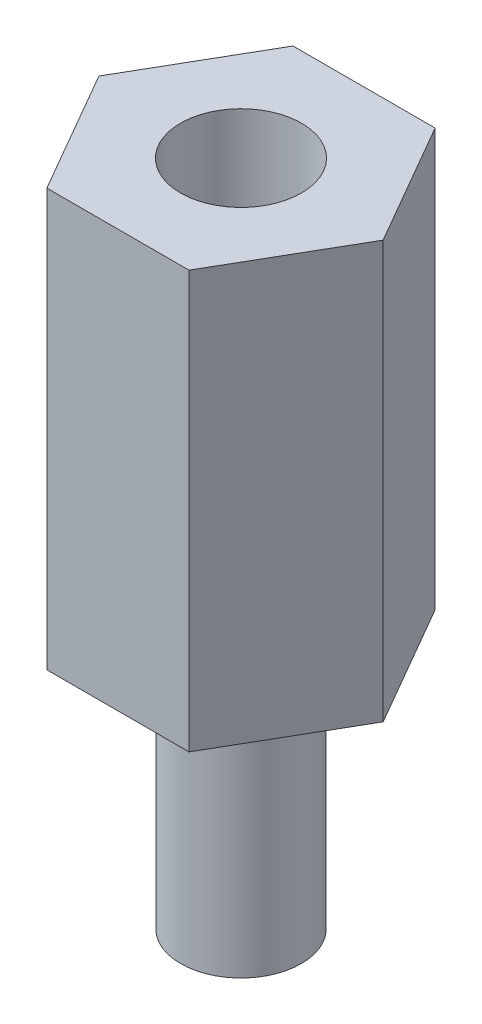
ISO-10303-21;
HEADER;
FILE_DESCRIPTION(('STEP AP214'),'2;1');
FILE_NAME('part.step','',(''),(''),'','','');
FILE_SCHEMA(('AUTOMOTIVE_DESIGN { 1 0 10303 214 1 1 1 1 }'));
ENDSEC;
DATA;
#1=APPLICATION_CONTEXT('core data for automotive mechanical design processes');
#2=APPLICATION_PROTOCOL_DEFINITION('international standard','automotive_design',2000,#1);
#3=PRODUCT_CONTEXT('',#1,'mechanical');
#4=PRODUCT('Part','Part','',(#3));
#5=PRODUCT_RELATED_PRODUCT_CATEGORY('part','',(#4));
#6=PRODUCT_DEFINITION_FORMATION('','',#4);
#7=PRODUCT_DEFINITION_CONTEXT('part definition',#1,'design');
#8=PRODUCT_DEFINITION('design','',#6,#7);
#9=PRODUCT_DEFINITION_SHAPE('','',#8);
#10=(LENGTH_UNIT() NAMED_UNIT(*) SI_UNIT(.MILLI.,.METRE.));
#11=(NAMED_UNIT(*) PLANE_ANGLE_UNIT() SI_UNIT($,.RADIAN.));
#12=(NAMED_UNIT(*) SI_UNIT($,.STERADIAN.) SOLID_ANGLE_UNIT());
#13=UNCERTAINTY_MEASURE_WITH_UNIT(LENGTH_MEASURE(1.E-05),#10,'distance_accuracy_value','');
#14=(GEOMETRIC_REPRESENTATION_CONTEXT(3) GLOBAL_UNCERTAINTY_ASSIGNED_CONTEXT((#13)) GLOBAL_UNIT_ASSIGNED_CONTEXT((#10,
#11,#12)) REPRESENTATION_CONTEXT('',''));
#15=CARTESIAN_POINT('',(0.,0.,0.));
#16=DIRECTION('',(0.,0.,1.));
#17=DIRECTION('',(1.,0.,0.));
#18=AXIS2_PLACEMENT_3D('',#15,#16,#17);
#19=CARTESIAN_POINT('',(1.70318329410942,10.,2.94999999999997));
#20=DIRECTION('',(-0.866025403784442,0.,-0.499999999999995));
#21=DIRECTION('',(-0.499999999999995,0.,0.866025403784442));
#22=AXIS2_PLACEMENT_3D('',#19,#20,#21);
#23=PLANE('',#22);
#24=DIRECTION('',(0.499999999999995,0.,-0.866025403784442));
#25=VECTOR('',#24,1.);
#26=CARTESIAN_POINT('',(1.70318329410942,0.,2.94999999999997));
#27=LINE('',#26,#25);
#28=CARTESIAN_POINT('',(1.70318329410942,0.,2.94999999999997));
#29=VERTEX_POINT('',#28);
#30=CARTESIAN_POINT('',(3.40636658821878,0.,0.));
#31=VERTEX_POINT('',#30);
#32=EDGE_CURVE('E118',#29,#31,#27,.T.);
#33=ORIENTED_EDGE('',*,*,#32,.T.);
#34=DIRECTION('',(0.,-1.,0.));
#35=VECTOR('',#34,1.);
#36=CARTESIAN_POINT('',(3.40636658821878,10.,0.));
#37=LINE('',#36,#35);
#38=CARTESIAN_POINT('',(3.40636658821878,10.,0.));
#39=VERTEX_POINT('',#38);
#40=EDGE_CURVE('E41',#39,#31,#37,.T.);
#41=ORIENTED_EDGE('',*,*,#40,.F.);
#42=DIRECTION('',(0.499999999999995,0.,-0.866025403784442));
#43=VECTOR('',#42,1.);
#44=CARTESIAN_POINT('',(1.70318329410942,10.,2.94999999999997));
#45=LINE('',#44,#43);
#46=CARTESIAN_POINT('',(1.70318329410942,10.,2.94999999999997));
#47=VERTEX_POINT('',#46);
#48=EDGE_CURVE('E129',#47,#39,#45,.T.);
#49=ORIENTED_EDGE('',*,*,#48,.F.);
#50=DIRECTION('',(0.,-1.,0.));
#51=VECTOR('',#50,1.);
#52=CARTESIAN_POINT('',(1.70318329410942,10.,2.94999999999997));
#53=LINE('',#52,#51);
#54=EDGE_CURVE('E114',#47,#29,#53,.T.);
#55=ORIENTED_EDGE('',*,*,#54,.T.);
#56=EDGE_LOOP('',(#33,#41,#49,#55));
#57=FACE_BOUND('',#56,.T.);
#58=ADVANCED_FACE('F33',(#57),#23,.F.);
#59=CARTESIAN_POINT('',(3.40636658821878,10.,0.));
#60=DIRECTION('',(-0.866025403784438,0.,0.500000000000001));
#61=DIRECTION('',(0.500000000000001,0.,0.866025403784438));
#62=AXIS2_PLACEMENT_3D('',#59,#60,#61);
#63=PLANE('',#62);
#64=DIRECTION('',(-0.500000000000001,0.,-0.866025403784438));
#65=VECTOR('',#64,1.);
#66=CARTESIAN_POINT('',(3.40636658821878,0.,0.));
#67=LINE('',#66,#65);
#68=CARTESIAN_POINT('',(1.70318329410938,0.,-2.94999999999999));
#69=VERTEX_POINT('',#68);
#70=EDGE_CURVE('E121',#31,#69,#67,.T.);
#71=ORIENTED_EDGE('',*,*,#70,.T.);
#72=DIRECTION('',(0.,-1.,0.));
#73=VECTOR('',#72,1.);
#74=CARTESIAN_POINT('',(1.70318329410938,10.,-2.94999999999999));
#75=LINE('',#74,#73);
#76=CARTESIAN_POINT('',(1.70318329410938,10.,-2.94999999999999));
#77=VERTEX_POINT('',#76);
#78=EDGE_CURVE('E133',#77,#69,#75,.T.);
#79=ORIENTED_EDGE('',*,*,#78,.F.);
#80=DIRECTION('',(-0.500000000000001,0.,-0.866025403784438));
#81=VECTOR('',#80,1.);
#82=CARTESIAN_POINT('',(3.40636658821878,10.,0.));
#83=LINE('',#82,#81);
#84=EDGE_CURVE('E87',#39,#77,#83,.T.);
#85=ORIENTED_EDGE('',*,*,#84,.F.);
#86=ORIENTED_EDGE('',*,*,#40,.T.);
#87=EDGE_LOOP('',(#71,#79,#85,#86));
#88=FACE_BOUND('',#87,.T.);
#89=ADVANCED_FACE('F136',(#88),#63,.F.);
#90=CARTESIAN_POINT('',(1.70318329410938,10.,-2.94999999999999));
#91=DIRECTION('',(0.,0.,1.));
#92=DIRECTION('',(1.,0.,0.));
#93=AXIS2_PLACEMENT_3D('',#90,#91,#92);
#94=PLANE('',#93);
#95=DIRECTION('',(-1.,0.,0.));
#96=VECTOR('',#95,1.);
#97=CARTESIAN_POINT('',(1.70318329410938,0.,-2.94999999999999));
#98=LINE('',#97,#96);
#99=CARTESIAN_POINT('',(-1.7031832941094,0.,-2.94999999999998));
#100=VERTEX_POINT('',#99);
#101=EDGE_CURVE('E124',#69,#100,#98,.T.);
#102=ORIENTED_EDGE('',*,*,#101,.T.);
#103=DIRECTION('',(0.,-1.,0.));
#104=VECTOR('',#103,1.);
#105=CARTESIAN_POINT('',(-1.7031832941094,10.,-2.94999999999998));
#106=LINE('',#105,#104);
#107=CARTESIAN_POINT('',(-1.7031832941094,10.,-2.94999999999998));
#108=VERTEX_POINT('',#107);
#109=EDGE_CURVE('E109',#108,#100,#106,.T.);
#110=ORIENTED_EDGE('',*,*,#109,.F.);
#111=DIRECTION('',(-1.,0.,0.));
#112=VECTOR('',#111,1.);
#113=CARTESIAN_POINT('',(1.70318329410938,10.,-2.94999999999999));
#114=LINE('',#113,#112);
#115=EDGE_CURVE('E100',#77,#108,#114,.T.);
#116=ORIENTED_EDGE('',*,*,#115,.F.);
#117=ORIENTED_EDGE('',*,*,#78,.T.);
#118=EDGE_LOOP('',(#102,#110,#116,#117));
#119=FACE_BOUND('',#118,.T.);
#120=ADVANCED_FACE('F144',(#119),#94,.F.);
#121=CARTESIAN_POINT('',(-1.7031832941094,10.,-2.94999999999998));
#122=DIRECTION('',(0.866025403784442,0.,0.499999999999995));
#123=DIRECTION('',(0.499999999999995,0.,-0.866025403784442));
#124=AXIS2_PLACEMENT_3D('',#121,#122,#123);
#125=PLANE('',#124);
#126=DIRECTION('',(-0.499999999999995,0.,0.866025403784442));
#127=VECTOR('',#126,1.);
#128=CARTESIAN_POINT('',(-1.7031832941094,0.,-2.94999999999998));
#129=LINE('',#128,#127);
#130=CARTESIAN_POINT('',(-3.40636658821878,0.,0.));
#131=VERTEX_POINT('',#130);
#132=EDGE_CURVE('E108',#100,#131,#129,.T.);
#133=ORIENTED_EDGE('',*,*,#132,.T.);
#134=DIRECTION('',(0.,-1.,0.));
#135=VECTOR('',#134,1.);
#136=CARTESIAN_POINT('',(-3.40636658821878,10.,0.));
#137=LINE('',#136,#135);
#138=CARTESIAN_POINT('',(-3.40636658821878,10.,0.));
#139=VERTEX_POINT('',#138);
#140=EDGE_CURVE('E105',#139,#131,#137,.T.);
#141=ORIENTED_EDGE('',*,*,#140,.F.);
#142=DIRECTION('',(-0.499999999999995,0.,0.866025403784442));
#143=VECTOR('',#142,1.);
#144=CARTESIAN_POINT('',(-1.7031832941094,10.,-2.94999999999998));
#145=LINE('',#144,#143);
#146=EDGE_CURVE('E94',#108,#139,#145,.T.);
#147=ORIENTED_EDGE('',*,*,#146,.F.);
#148=ORIENTED_EDGE('',*,*,#109,.T.);
#149=EDGE_LOOP('',(#133,#141,#147,#148));
#150=FACE_BOUND('',#149,.T.);
#151=ADVANCED_FACE('F106',(#150),#125,.F.);
#152=CARTESIAN_POINT('',(-3.40636658821878,10.,0.));
#153=DIRECTION('',(0.866025403784435,0.,-0.500000000000007));
#154=DIRECTION('',(-0.500000000000007,0.,-0.866025403784435));
#155=AXIS2_PLACEMENT_3D('',#152,#153,#154);
#156=PLANE('',#155);
#157=DIRECTION('',(0.500000000000007,0.,0.866025403784435));
#158=VECTOR('',#157,1.);
#159=CARTESIAN_POINT('',(-3.40636658821878,0.,0.));
#160=LINE('',#159,#158);
#161=CARTESIAN_POINT('',(-1.70318329410936,0.,2.95000000000001));
#162=VERTEX_POINT('',#161);
#163=EDGE_CURVE('E72',#131,#162,#160,.T.);
#164=ORIENTED_EDGE('',*,*,#163,.T.);
#165=DIRECTION('',(0.,-1.,0.));
#166=VECTOR('',#165,1.);
#167=CARTESIAN_POINT('',(-1.70318329410936,10.,2.95000000000001));
#168=LINE('',#167,#166);
#169=CARTESIAN_POINT('',(-1.70318329410936,10.,2.95000000000001));
#170=VERTEX_POINT('',#169);
#171=EDGE_CURVE('E110',#170,#162,#168,.T.);
#172=ORIENTED_EDGE('',*,*,#171,.F.);
#173=DIRECTION('',(0.500000000000007,0.,0.866025403784435));
#174=VECTOR('',#173,1.);
#175=CARTESIAN_POINT('',(-3.40636658821878,10.,0.));
#176=LINE('',#175,#174);
#177=EDGE_CURVE('E98',#139,#170,#176,.T.);
#178=ORIENTED_EDGE('',*,*,#177,.F.);
#179=ORIENTED_EDGE('',*,*,#140,.T.);
#180=EDGE_LOOP('',(#164,#172,#178,#179));
#181=FACE_BOUND('',#180,.T.);
#182=ADVANCED_FACE('F112',(#181),#156,.F.);
#183=CARTESIAN_POINT('',(-1.70318329410936,10.,2.95000000000001));
#184=DIRECTION('',(0.,0.,-1.));
#185=DIRECTION('',(-1.,0.,0.));
#186=AXIS2_PLACEMENT_3D('',#183,#184,#185);
#187=PLANE('',#186);
#188=DIRECTION('',(1.,0.,0.));
#189=VECTOR('',#188,1.);
#190=CARTESIAN_POINT('',(-1.70318329410936,0.,2.95000000000001));
#191=LINE('',#190,#189);
#192=EDGE_CURVE('E78',#162,#29,#191,.T.);
#193=ORIENTED_EDGE('',*,*,#192,.T.);
#194=ORIENTED_EDGE('',*,*,#54,.F.);
#195=DIRECTION('',(1.,0.,0.));
#196=VECTOR('',#195,1.);
#197=CARTESIAN_POINT('',(-1.70318329410936,10.,2.95000000000001));
#198=LINE('',#197,#196);
#199=EDGE_CURVE('E49',#170,#47,#198,.T.);
#200=ORIENTED_EDGE('',*,*,#199,.F.);
#201=ORIENTED_EDGE('',*,*,#171,.T.);
#202=EDGE_LOOP('',(#193,#194,#200,#201));
#203=FACE_BOUND('',#202,.T.);
#204=ADVANCED_FACE('F167',(#203),#187,.F.);
#205=CARTESIAN_POINT('',(0.,10.,0.));
#206=DIRECTION('',(0.,1.,0.));
#207=DIRECTION('',(0.,0.,1.));
#208=AXIS2_PLACEMENT_3D('',#205,#206,#207);
#209=PLANE('',#208);
#210=CARTESIAN_POINT('',(0.,10.,0.));
#211=DIRECTION('',(0.,1.,0.));
#212=DIRECTION('',(0.,0.,1.));
#213=AXIS2_PLACEMENT_3D('',#210,#211,#212);
#214=CIRCLE('',#213,1.45);
#215=CARTESIAN_POINT('',(0.,10.,1.45));
#216=VERTEX_POINT('',#215);
#217=EDGE_CURVE('E151',#216,#216,#214,.T.);
#218=ORIENTED_EDGE('',*,*,#217,.F.);
#219=EDGE_LOOP('',(#218));
#220=FACE_BOUND('',#219,.T.);
#221=ORIENTED_EDGE('',*,*,#48,.T.);
#222=ORIENTED_EDGE('',*,*,#84,.T.);
#223=ORIENTED_EDGE('',*,*,#115,.T.);
#224=ORIENTED_EDGE('',*,*,#146,.T.);
#225=ORIENTED_EDGE('',*,*,#177,.T.);
#226=ORIENTED_EDGE('',*,*,#199,.T.);
#227=EDGE_LOOP('',(#221,#222,#223,#224,#225,#226));
#228=FACE_BOUND('',#227,.T.);
#229=ADVANCED_FACE('F96',(#220,#228),#209,.T.);
#230=CARTESIAN_POINT('',(0.,0.,0.));
#231=DIRECTION('',(0.,1.,0.));
#232=DIRECTION('',(0.,0.,1.));
#233=AXIS2_PLACEMENT_3D('',#230,#231,#232);
#234=PLANE('',#233);
#235=CARTESIAN_POINT('',(0.,0.,0.));
#236=DIRECTION('',(0.,1.,0.));
#237=DIRECTION('',(0.,0.,1.));
#238=AXIS2_PLACEMENT_3D('',#235,#236,#237);
#239=CIRCLE('',#238,1.445);
#240=CARTESIAN_POINT('',(0.,0.,1.445));
#241=VERTEX_POINT('',#240);
#242=EDGE_CURVE('E11',#241,#241,#239,.F.);
#243=ORIENTED_EDGE('',*,*,#242,.F.);
#244=EDGE_LOOP('',(#243));
#245=FACE_BOUND('',#244,.T.);
#246=ORIENTED_EDGE('',*,*,#32,.F.);
#247=ORIENTED_EDGE('',*,*,#192,.F.);
#248=ORIENTED_EDGE('',*,*,#163,.F.);
#249=ORIENTED_EDGE('',*,*,#132,.F.);
#250=ORIENTED_EDGE('',*,*,#101,.F.);
#251=ORIENTED_EDGE('',*,*,#70,.F.);
#252=EDGE_LOOP('',(#246,#247,#248,#249,#250,#251));
#253=FACE_BOUND('',#252,.T.);
#254=ADVANCED_FACE('F141',(#245,#253),#234,.F.);
#255=CARTESIAN_POINT('',(0.,-6.,0.));
#256=DIRECTION('',(0.,1.,0.));
#257=DIRECTION('',(0.,0.,1.));
#258=AXIS2_PLACEMENT_3D('',#255,#256,#257);
#259=CYLINDRICAL_SURFACE('',#258,1.445);
#260=CARTESIAN_POINT('',(0.,-6.,0.));
#261=DIRECTION('',(0.,-1.,0.));
#262=DIRECTION('',(0.,0.,-1.));
#263=AXIS2_PLACEMENT_3D('',#260,#261,#262);
#264=CIRCLE('',#263,1.445);
#265=CARTESIAN_POINT('',(0.,-6.,-1.445));
#266=VERTEX_POINT('',#265);
#267=EDGE_CURVE('E122',#266,#266,#264,.T.);
#268=ORIENTED_EDGE('',*,*,#267,.F.);
#269=EDGE_LOOP('',(#268));
#270=FACE_BOUND('',#269,.T.);
#271=ORIENTED_EDGE('',*,*,#242,.T.);
#272=EDGE_LOOP('',(#271));
#273=FACE_BOUND('',#272,.T.);
#274=ADVANCED_FACE('F173',(#270,#273),#259,.T.);
#275=CARTESIAN_POINT('',(0.,-6.,0.));
#276=DIRECTION('',(0.,-1.,0.));
#277=DIRECTION('',(0.,0.,-1.));
#278=AXIS2_PLACEMENT_3D('',#275,#276,#277);
#279=PLANE('',#278);
#280=ORIENTED_EDGE('',*,*,#267,.T.);
#281=EDGE_LOOP('',(#280));
#282=FACE_BOUND('',#281,.T.);
#283=ADVANCED_FACE('F162',(#282),#279,.T.);
#284=CARTESIAN_POINT('',(0.,4.,0.));
#285=DIRECTION('',(0.,1.,0.));
#286=DIRECTION('',(0.,0.,1.));
#287=AXIS2_PLACEMENT_3D('',#284,#285,#286);
#288=CYLINDRICAL_SURFACE('',#287,1.45);
#289=CARTESIAN_POINT('',(0.,4.,0.));
#290=DIRECTION('',(0.,1.,0.));
#291=DIRECTION('',(0.,0.,1.));
#292=AXIS2_PLACEMENT_3D('',#289,#290,#291);
#293=CIRCLE('',#292,1.45);
#294=CARTESIAN_POINT('',(0.,4.,1.45));
#295=VERTEX_POINT('',#294);
#296=EDGE_CURVE('E150',#295,#295,#293,.T.);
#297=ORIENTED_EDGE('',*,*,#296,.F.);
#298=EDGE_LOOP('',(#297));
#299=FACE_BOUND('',#298,.T.);
#300=ORIENTED_EDGE('',*,*,#217,.T.);
#301=EDGE_LOOP('',(#300));
#302=FACE_BOUND('',#301,.T.);
#303=ADVANCED_FACE('F159',(#299,#302),#288,.F.);
#304=CARTESIAN_POINT('',(0.,4.,0.));
#305=DIRECTION('',(0.,1.,0.));
#306=DIRECTION('',(0.,0.,1.));
#307=AXIS2_PLACEMENT_3D('',#304,#305,#306);
#308=PLANE('',#307);
#309=ORIENTED_EDGE('',*,*,#296,.T.);
#310=EDGE_LOOP('',(#309));
#311=FACE_BOUND('',#310,.T.);
#312=ADVANCED_FACE('F157',(#311),#308,.T.);
#313=CLOSED_SHELL('',(#58,#89,#120,#151,#182,#204,#229,#254,#274,#283,#303,#312));
#314=MANIFOLD_SOLID_BREP('B2',#313);
#315=ADVANCED_BREP_SHAPE_REPRESENTATION('',(#18,#314),#14);
#316=SHAPE_DEFINITION_REPRESENTATION(#9,#315);
ENDSEC;
END-ISO-10303-21;
